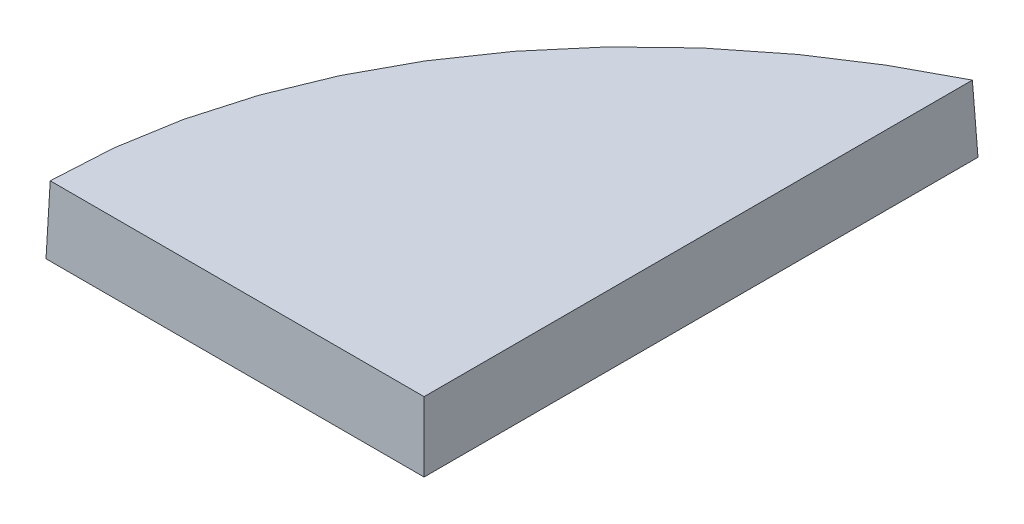
ISO-10303-21;
HEADER;
FILE_DESCRIPTION(('STEP AP214'),'2;1');
FILE_NAME('part.step','',(''),(''),'','','');
FILE_SCHEMA(('AUTOMOTIVE_DESIGN { 1 0 10303 214 1 1 1 1 }'));
ENDSEC;
DATA;
#1=APPLICATION_CONTEXT('core data for automotive mechanical design processes');
#2=APPLICATION_PROTOCOL_DEFINITION('international standard','automotive_design',2000,#1);
#3=PRODUCT_CONTEXT('',#1,'mechanical');
#4=PRODUCT('Part','Part','',(#3));
#5=PRODUCT_RELATED_PRODUCT_CATEGORY('part','',(#4));
#6=PRODUCT_DEFINITION_FORMATION('','',#4);
#7=PRODUCT_DEFINITION_CONTEXT('part definition',#1,'design');
#8=PRODUCT_DEFINITION('design','',#6,#7);
#9=PRODUCT_DEFINITION_SHAPE('','',#8);
#10=(LENGTH_UNIT() NAMED_UNIT(*) SI_UNIT(.MILLI.,.METRE.));
#11=(NAMED_UNIT(*) PLANE_ANGLE_UNIT() SI_UNIT($,.RADIAN.));
#12=(NAMED_UNIT(*) SI_UNIT($,.STERADIAN.) SOLID_ANGLE_UNIT());
#13=UNCERTAINTY_MEASURE_WITH_UNIT(LENGTH_MEASURE(1.E-05),#10,'distance_accuracy_value','');
#14=(GEOMETRIC_REPRESENTATION_CONTEXT(3) GLOBAL_UNCERTAINTY_ASSIGNED_CONTEXT((#13)) GLOBAL_UNIT_ASSIGNED_CONTEXT((#10,
#11,#12)) REPRESENTATION_CONTEXT('',''));
#15=CARTESIAN_POINT('',(0.,0.,0.));
#16=DIRECTION('',(0.,0.,1.));
#17=DIRECTION('',(1.,0.,0.));
#18=AXIS2_PLACEMENT_3D('',#15,#16,#17);
#19=CARTESIAN_POINT('',(-18.5,-156.5,21.131836958515));
#20=DIRECTION('',(-1.,0.,0.));
#21=DIRECTION('',(0.,0.,1.));
#22=AXIS2_PLACEMENT_3D('',#19,#20,#21);
#23=PLANE('',#22);
#24=CARTESIAN_POINT('',(-18.5,-190.,-27.8348909743788));
#25=CARTESIAN_POINT('',(-18.5,-188.833333333333,-27.7406024281379));
#26=CARTESIAN_POINT('',(-18.5,-187.666666666667,-27.646313881897));
#27=CARTESIAN_POINT('',(-18.5,-186.5,-27.552025335656));
#28=B_SPLINE_CURVE_WITH_KNOTS('',3,(#24,#25,#26,#27),.UNSPECIFIED.,.F.,.F.,(4,4),(0.,
3.51141181999062),.UNSPECIFIED.);
#29=CARTESIAN_POINT('',(-18.4999996475401,-190.,-27.8348920437937));
#30=VERTEX_POINT('',#29);
#31=CARTESIAN_POINT('',(-18.5,-186.5,-27.552025335656));
#32=VERTEX_POINT('',#31);
#33=EDGE_CURVE('E80',#30,#32,#28,.T.);
#34=ORIENTED_EDGE('',*,*,#33,.T.);
#35=DIRECTION('',(0.,0.,-1.));
#36=VECTOR('',#35,1.);
#37=CARTESIAN_POINT('',(-18.5,-186.5,21.131836958515));
#38=LINE('',#37,#36);
#39=CARTESIAN_POINT('',(-18.5,-186.5,0.));
#40=VERTEX_POINT('',#39);
#41=EDGE_CURVE('E11',#40,#32,#38,.T.);
#42=ORIENTED_EDGE('',*,*,#41,.F.);
#43=DIRECTION('',(0.,-1.,0.));
#44=VECTOR('',#43,1.);
#45=CARTESIAN_POINT('',(-18.5,0.,0.));
#46=LINE('',#45,#44);
#47=CARTESIAN_POINT('',(-18.5,-190.,0.));
#48=VERTEX_POINT('',#47);
#49=EDGE_CURVE('E48',#40,#48,#46,.T.);
#50=ORIENTED_EDGE('',*,*,#49,.T.);
#51=DIRECTION('',(0.,0.,1.));
#52=VECTOR('',#51,1.);
#53=CARTESIAN_POINT('',(-18.5,-190.,0.));
#54=LINE('',#53,#52);
#55=EDGE_CURVE('E62',#30,#48,#54,.T.);
#56=ORIENTED_EDGE('',*,*,#55,.F.);
#57=EDGE_LOOP('',(#34,#42,#50,#56));
#58=FACE_BOUND('',#57,.T.);
#59=ADVANCED_FACE('F43',(#58),#23,.F.);
#60=CARTESIAN_POINT('',(0.,0.,0.));
#61=DIRECTION('',(0.,0.,1.));
#62=DIRECTION('',(1.,0.,0.));
#63=AXIS2_PLACEMENT_3D('',#60,#61,#62);
#64=PLANE('',#63);
#65=CARTESIAN_POINT('',(-37.5,-190.,0.));
#66=CARTESIAN_POINT('',(-37.4293854668902,-188.833333333333,0.));
#67=CARTESIAN_POINT('',(-37.3587709337804,-187.666666666667,0.));
#68=CARTESIAN_POINT('',(-37.2881564006706,-186.5,0.));
#69=B_SPLINE_CURVE_WITH_KNOTS('',3,(#65,#66,#67,#68),.UNSPECIFIED.,.F.,.F.,(4,4),(0.,
3.50640524049586),.UNSPECIFIED.);
#70=CARTESIAN_POINT('',(-37.5,-190.,0.));
#71=VERTEX_POINT('',#70);
#72=CARTESIAN_POINT('',(-37.2881564006706,-186.5,0.));
#73=VERTEX_POINT('',#72);
#74=EDGE_CURVE('E95',#71,#73,#69,.T.);
#75=ORIENTED_EDGE('',*,*,#74,.F.);
#76=DIRECTION('',(1.,0.,0.));
#77=VECTOR('',#76,1.);
#78=CARTESIAN_POINT('',(0.,-190.,0.));
#79=LINE('',#78,#77);
#80=EDGE_CURVE('E86',#71,#48,#79,.T.);
#81=ORIENTED_EDGE('',*,*,#80,.T.);
#82=ORIENTED_EDGE('',*,*,#49,.F.);
#83=DIRECTION('',(1.,0.,0.));
#84=VECTOR('',#83,1.);
#85=CARTESIAN_POINT('',(0.,-186.5,0.));
#86=LINE('',#85,#84);
#87=EDGE_CURVE('E84',#73,#40,#86,.T.);
#88=ORIENTED_EDGE('',*,*,#87,.F.);
#89=EDGE_LOOP('',(#75,#81,#82,#88));
#90=FACE_BOUND('',#89,.T.);
#91=ADVANCED_FACE('F81',(#90),#64,.T.);
#92=CARTESIAN_POINT('',(0.086150742203567,-186.5,-28.2226236497702));
#93=DIRECTION('',(0.,1.,0.));
#94=DIRECTION('',(0.,0.,1.));
#95=AXIS2_PLACEMENT_3D('',#92,#93,#94);
#96=PLANE('',#95);
#97=CARTESIAN_POINT('',(-37.2881564006706,-186.5,0.));
#98=CARTESIAN_POINT('',(-37.28817393357,-186.5,-0.422864633260381));
#99=CARTESIAN_POINT('',(-37.2782314286784,-186.5,-0.845726342583551));
#100=CARTESIAN_POINT('',(-37.2385336947082,-186.5,-1.69041373260461));
#101=CARTESIAN_POINT('',(-37.2087833960445,-186.5,-2.11223964490709));
#102=CARTESIAN_POINT('',(-37.1295812498374,-186.5,-2.95399497116576));
#103=CARTESIAN_POINT('',(-37.0801313518568,-186.5,-3.37392456863221));
#104=CARTESIAN_POINT('',(-36.9618263393956,-186.5,-4.21035281825607));
#105=CARTESIAN_POINT('',(-36.8930023745945,-186.5,-4.62685588221071));
#106=CARTESIAN_POINT('',(-36.7361744606546,-186.5,-5.45627240838134));
#107=CARTESIAN_POINT('',(-36.6481690812121,-186.5,-5.86918560052181));
#108=CARTESIAN_POINT('',(-36.4533211887762,-186.5,-6.69055817067994));
#109=CARTESIAN_POINT('',(-36.3464767585354,-186.5,-7.09901709089019));
#110=CARTESIAN_POINT('',(-36.0199341078184,-186.5,-8.24069586877532));
#111=CARTESIAN_POINT('',(-35.7791036416192,-186.5,-8.96798424608168));
#112=CARTESIAN_POINT('',(-35.2395897131709,-186.5,-10.4007347308088));
#113=CARTESIAN_POINT('',(-34.9408993303456,-186.5,-11.1061942155763));
#114=CARTESIAN_POINT('',(-34.2887634899795,-186.5,-12.4918183471616));
#115=CARTESIAN_POINT('',(-33.9352863046686,-186.5,-13.1719680519123));
#116=CARTESIAN_POINT('',(-33.1773340885285,-186.5,-14.5031605254986));
#117=CARTESIAN_POINT('',(-32.772859073099,-186.5,-15.1542033031235));
#118=CARTESIAN_POINT('',(-31.8878765189557,-186.5,-16.4671751168401));
#119=CARTESIAN_POINT('',(-31.4040845027735,-186.5,-17.1268899075625));
#120=CARTESIAN_POINT('',(-30.387389323263,-186.5,-18.4073173368888));
#121=CARTESIAN_POINT('',(-29.8544823658119,-186.5,-19.0280269561085));
#122=CARTESIAN_POINT('',(-28.7437330283484,-186.5,-20.2288372158535));
#123=CARTESIAN_POINT('',(-28.1658496006087,-186.5,-20.8088998204753));
#124=CARTESIAN_POINT('',(-26.9701520805737,-186.5,-21.9261479957297));
#125=CARTESIAN_POINT('',(-26.3523411930227,-186.5,-22.4633369998601));
#126=CARTESIAN_POINT('',(-25.1613946898197,-186.5,-23.4286437613523));
#127=CARTESIAN_POINT('',(-24.5924638618874,-186.5,-23.8619700198312));
#128=CARTESIAN_POINT('',(-23.4301482097787,-186.5,-24.6944983620204));
#129=CARTESIAN_POINT('',(-22.8367628704026,-186.5,-25.0936997262531));
#130=CARTESIAN_POINT('',(-21.6303704551137,-186.5,-25.8561783406228));
#131=CARTESIAN_POINT('',(-21.0174417089708,-186.5,-26.2195797456421));
#132=CARTESIAN_POINT('',(-19.7724704609528,-186.5,-26.9117867399923));
#133=CARTESIAN_POINT('',(-19.1404310669717,-186.5,-27.2405979160601));
#134=CARTESIAN_POINT('',(-18.5,-186.5,-27.552025335656));
#135=B_SPLINE_CURVE_WITH_KNOTS('',3,(#97,#98,#99,#100,#101,#102,#103,#104,#105,#106,#107,#108,
#109,#110,#111,#112,#113,#114,#115,#116,#117,#118,#119,#120,#121,#122,#123,#124,#125,#126,#127,
#128,#129,#130,#131,#132,#133,#134),.UNSPECIFIED.,.F.,.F.,(4,2,2,2,2,2,2,2,2,2,2,2,2,2,2,2,2,2,
4),(0.,1.26847212285447,2.53662862464043,3.80465965501022,5.07066347291565,6.33676172545291,
7.60298890306524,9.89859698386737,12.1944798101535,14.4916972152165,16.7889139265952,
19.2406773062046,21.6926302432214,24.1468478017684,26.6008686186488,28.7451196966726,
30.8894159722074,33.0259926694794,35.1622237524619),.UNSPECIFIED.);
#136=EDGE_CURVE('E88',#73,#32,#135,.T.);
#137=ORIENTED_EDGE('',*,*,#136,.F.);
#138=ORIENTED_EDGE('',*,*,#87,.T.);
#139=ORIENTED_EDGE('',*,*,#41,.T.);
#140=EDGE_LOOP('',(#137,#138,#139));
#141=FACE_BOUND('',#140,.T.);
#142=ADVANCED_FACE('F90',(#141),#96,.T.);
#143=CARTESIAN_POINT('',(-0.0942476803876341,-190.,31.9998989353041));
#144=CARTESIAN_POINT('',(0.,0.,17.5));
#145=CARTESIAN_POINT('',(0.000942476803874733,1.9,17.355001010647));
#146=CARTESIAN_POINT('',(74.9055154492315,-190.,32.1607483098324));
#147=CARTESIAN_POINT('',(52.,0.,17.5));
#148=CARTESIAN_POINT('',(51.7709448455077,1.9,17.3533925169017));
#149=CARTESIAN_POINT('',(75.0940108100067,-190.,-31.839049560776));
#150=CARTESIAN_POINT('',(52.,0.,-17.5));
#151=CARTESIAN_POINT('',(51.7690598918999,1.9,-17.3566095043922));
#152=CARTESIAN_POINT('',(0.0942476803875962,-190.,-31.9998989353041));
#153=CARTESIAN_POINT('',(0.,0.,-17.5));
#154=CARTESIAN_POINT('',(-0.000942476803871138,1.9,-17.355001010647));
#155=CARTESIAN_POINT('',(-74.9055154492314,-190.,-32.1607483098323));
#156=CARTESIAN_POINT('',(-52.,0.,-17.5));
#157=CARTESIAN_POINT('',(-51.7709448455077,1.9,-17.3533925169017));
#158=CARTESIAN_POINT('',(-75.0940108100066,-190.,31.839049560776));
#159=CARTESIAN_POINT('',(-52.,0.,17.5));
#160=CARTESIAN_POINT('',(-51.7690598918999,1.9,17.3566095043922));
#161=CARTESIAN_POINT('',(-0.0942476803876341,-190.,31.9998989353041));
#162=CARTESIAN_POINT('',(0.,0.,17.5));
#163=CARTESIAN_POINT('',(0.000942476803874733,1.9,17.355001010647));
#164=(BOUNDED_SURFACE() B_SPLINE_SURFACE(3,1,((#143,#144,#145),(#146,#147,#148),(#149,#150,
#151),(#152,#153,#154),(#155,#156,#157),(#158,#159,#160),(#161,#162,#163)),.UNSPECIFIED.,.T.,
.F.,.F.) B_SPLINE_SURFACE_WITH_KNOTS((4,3,4),(2,1,2),(0.,0.5,1.),(0.,1.,1.01),
.UNSPECIFIED.) GEOMETRIC_REPRESENTATION_ITEM() RATIONAL_B_SPLINE_SURFACE(((1.,1.,1.),
(0.333333333333333,0.333333333333333,0.333333333333333),(0.333333333333333,0.333333333333333,
0.333333333333333),(1.,1.,1.),(0.333333333333333,0.333333333333333,0.333333333333333),
(0.333333333333333,0.333333333333333,0.333333333333333),(1.,1.,1.))) REPRESENTATION_ITEM('') SURFACE());
#165=CARTESIAN_POINT('',(0.,-190.,0.));
#166=DIRECTION('',(0.,1.,0.));
#167=DIRECTION('',(1.,0.,0.));
#168=AXIS2_PLACEMENT_3D('',#165,#166,#167);
#169=ELLIPSE('',#168,37.5,32.);
#170=EDGE_CURVE('E52',#30,#71,#169,.T.);
#171=ORIENTED_EDGE('',*,*,#74,.T.);
#172=ORIENTED_EDGE('',*,*,#136,.T.);
#173=ORIENTED_EDGE('',*,*,#33,.F.);
#174=ORIENTED_EDGE('',*,*,#170,.T.);
#175=EDGE_LOOP('',(#171,#172,#173,#174));
#176=FACE_BOUND('',#175,.T.);
#177=ADVANCED_FACE('F113',(#176),#164,.T.);
#178=CARTESIAN_POINT('',(0.,-190.,0.));
#179=DIRECTION('',(0.,1.,0.));
#180=DIRECTION('',(0.,0.,1.));
#181=AXIS2_PLACEMENT_3D('',#178,#179,#180);
#182=PLANE('',#181);
#183=ORIENTED_EDGE('',*,*,#80,.F.);
#184=ORIENTED_EDGE('',*,*,#170,.F.);
#185=ORIENTED_EDGE('',*,*,#55,.T.);
#186=EDGE_LOOP('',(#183,#184,#185));
#187=FACE_BOUND('',#186,.T.);
#188=ADVANCED_FACE('F44',(#187),#182,.F.);
#189=CLOSED_SHELL('',(#59,#91,#142,#177,#188));
#190=MANIFOLD_SOLID_BREP('B2',#189);
#191=ADVANCED_BREP_SHAPE_REPRESENTATION('',(#18,#190),#14);
#192=SHAPE_DEFINITION_REPRESENTATION(#9,#191);
ENDSEC;
END-ISO-10303-21;
